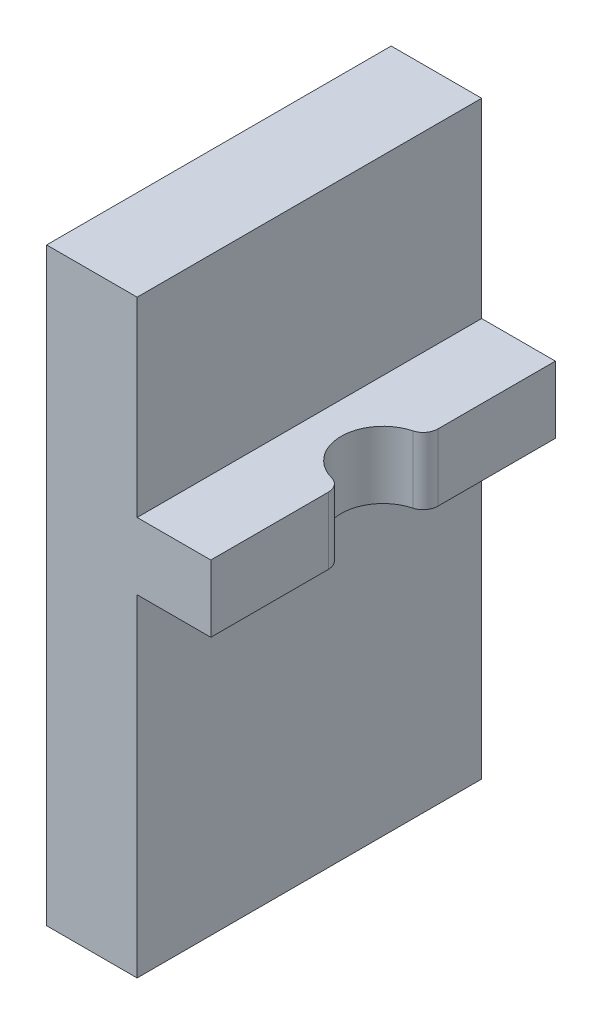
ISO-10303-21;
HEADER;
FILE_DESCRIPTION(('STEP AP214'),'2;1');
FILE_NAME('part.step','',(''),(''),'','','');
FILE_SCHEMA(('AUTOMOTIVE_DESIGN { 1 0 10303 214 1 1 1 1 }'));
ENDSEC;
DATA;
#1=APPLICATION_CONTEXT('core data for automotive mechanical design processes');
#2=APPLICATION_PROTOCOL_DEFINITION('international standard','automotive_design',2000,#1);
#3=PRODUCT_CONTEXT('',#1,'mechanical');
#4=PRODUCT('Part','Part','',(#3));
#5=PRODUCT_RELATED_PRODUCT_CATEGORY('part','',(#4));
#6=PRODUCT_DEFINITION_FORMATION('','',#4);
#7=PRODUCT_DEFINITION_CONTEXT('part definition',#1,'design');
#8=PRODUCT_DEFINITION('design','',#6,#7);
#9=PRODUCT_DEFINITION_SHAPE('','',#8);
#10=(LENGTH_UNIT() NAMED_UNIT(*) SI_UNIT(.MILLI.,.METRE.));
#11=(NAMED_UNIT(*) PLANE_ANGLE_UNIT() SI_UNIT($,.RADIAN.));
#12=(NAMED_UNIT(*) SI_UNIT($,.STERADIAN.) SOLID_ANGLE_UNIT());
#13=UNCERTAINTY_MEASURE_WITH_UNIT(LENGTH_MEASURE(1.E-05),#10,'distance_accuracy_value','');
#14=(GEOMETRIC_REPRESENTATION_CONTEXT(3) GLOBAL_UNCERTAINTY_ASSIGNED_CONTEXT((#13)) GLOBAL_UNIT_ASSIGNED_CONTEXT((#10,
#11,#12)) REPRESENTATION_CONTEXT('',''));
#15=CARTESIAN_POINT('',(0.,0.,0.));
#16=DIRECTION('',(0.,0.,1.));
#17=DIRECTION('',(1.,0.,0.));
#18=AXIS2_PLACEMENT_3D('',#15,#16,#17);
#19=CARTESIAN_POINT('',(-12.6648576385219,0.,0.));
#20=DIRECTION('',(1.,0.,0.));
#21=DIRECTION('',(0.,0.,-1.));
#22=AXIS2_PLACEMENT_3D('',#19,#20,#21);
#23=PLANE('',#22);
#24=DIRECTION('',(0.,0.,1.));
#25=VECTOR('',#24,1.);
#26=CARTESIAN_POINT('',(-12.6648576385219,54.1141840421285,27.1506107128126));
#27=LINE('',#26,#25);
#28=CARTESIAN_POINT('',(-12.6648576385219,54.1141840421285,-19.5956581666387));
#29=VERTEX_POINT('',#28);
#30=CARTESIAN_POINT('',(-12.6648576385219,54.1141840421285,-3.66328566896939));
#31=VERTEX_POINT('',#30);
#32=EDGE_CURVE('E266',#29,#31,#27,.T.);
#33=ORIENTED_EDGE('',*,*,#32,.T.);
#34=DIRECTION('',(0.,-1.,0.));
#35=VECTOR('',#34,1.);
#36=CARTESIAN_POINT('',(-12.6648576385219,45.0345450890142,-3.66328566896939));
#37=LINE('',#36,#35);
#38=CARTESIAN_POINT('',(-12.6648576385219,45.0345450890142,-3.66328566896939));
#39=VERTEX_POINT('',#38);
#40=EDGE_CURVE('E11',#31,#39,#37,.T.);
#41=ORIENTED_EDGE('',*,*,#40,.T.);
#42=DIRECTION('',(0.,0.,-1.));
#43=VECTOR('',#42,1.);
#44=CARTESIAN_POINT('',(-12.6648576385219,45.0345450890142,27.1506107128126));
#45=LINE('',#44,#43);
#46=CARTESIAN_POINT('',(-12.6648576385219,45.0345450890142,-19.5956581666387));
#47=VERTEX_POINT('',#46);
#48=EDGE_CURVE('E140',#39,#47,#45,.T.);
#49=ORIENTED_EDGE('',*,*,#48,.T.);
#50=DIRECTION('',(0.,1.,0.));
#51=VECTOR('',#50,1.);
#52=CARTESIAN_POINT('',(-12.6648576385219,54.1141840421285,-19.5956581666387));
#53=LINE('',#52,#51);
#54=EDGE_CURVE('E139',#47,#29,#53,.T.);
#55=ORIENTED_EDGE('',*,*,#54,.T.);
#56=EDGE_LOOP('',(#33,#41,#49,#55));
#57=FACE_BOUND('',#56,.T.);
#58=ADVANCED_FACE('F39',(#57),#23,.T.);
#59=CARTESIAN_POINT('',(-22.6648576385219,80.,-19.5956581666387));
#60=DIRECTION('',(-1.,0.,0.));
#61=DIRECTION('',(0.,0.,1.));
#62=AXIS2_PLACEMENT_3D('',#59,#60,#61);
#63=PLANE('',#62);
#64=DIRECTION('',(0.,0.,1.));
#65=VECTOR('',#64,1.);
#66=CARTESIAN_POINT('',(-22.6648576385219,54.1141840421285,27.1506107128126));
#67=LINE('',#66,#65);
#68=CARTESIAN_POINT('',(-22.6648576385219,54.1141840421285,-19.5956581666387));
#69=VERTEX_POINT('',#68);
#70=CARTESIAN_POINT('',(-22.6648576385219,54.1141840421285,27.1506107128126));
#71=VERTEX_POINT('',#70);
#72=EDGE_CURVE('E151',#69,#71,#67,.T.);
#73=ORIENTED_EDGE('',*,*,#72,.F.);
#74=DIRECTION('',(0.,-1.,0.));
#75=VECTOR('',#74,1.);
#76=CARTESIAN_POINT('',(-22.6648576385219,80.,-19.5956581666387));
#77=LINE('',#76,#75);
#78=CARTESIAN_POINT('',(-22.6648576385219,80.,-19.5956581666387));
#79=VERTEX_POINT('',#78);
#80=EDGE_CURVE('E198',#79,#69,#77,.T.);
#81=ORIENTED_EDGE('',*,*,#80,.F.);
#82=DIRECTION('',(0.,0.,-1.));
#83=VECTOR('',#82,1.);
#84=CARTESIAN_POINT('',(-22.6648576385219,80.,-19.5956581666387));
#85=LINE('',#84,#83);
#86=CARTESIAN_POINT('',(-22.6648576385219,80.,27.1506107128126));
#87=VERTEX_POINT('',#86);
#88=EDGE_CURVE('E179',#87,#79,#85,.T.);
#89=ORIENTED_EDGE('',*,*,#88,.F.);
#90=DIRECTION('',(0.,-1.,0.));
#91=VECTOR('',#90,1.);
#92=CARTESIAN_POINT('',(-22.6648576385219,80.,27.1506107128126));
#93=LINE('',#92,#91);
#94=EDGE_CURVE('E202',#87,#71,#93,.T.);
#95=ORIENTED_EDGE('',*,*,#94,.T.);
#96=EDGE_LOOP('',(#73,#81,#89,#95));
#97=FACE_BOUND('',#96,.T.);
#98=ADVANCED_FACE('F253',(#97),#63,.F.);
#99=DIRECTION('',(0.,0.,-1.));
#100=VECTOR('',#99,1.);
#101=CARTESIAN_POINT('',(-22.6648576385219,45.0345450890142,27.1506107128126));
#102=LINE('',#101,#100);
#103=CARTESIAN_POINT('',(-22.6648576385219,45.0345450890142,27.1506107128126));
#104=VERTEX_POINT('',#103);
#105=CARTESIAN_POINT('',(-22.6648576385219,45.0345450890142,-19.5956581666387));
#106=VERTEX_POINT('',#105);
#107=EDGE_CURVE('E257',#104,#106,#102,.T.);
#108=ORIENTED_EDGE('',*,*,#107,.F.);
#109=CARTESIAN_POINT('',(-22.6648576385219,0.,27.1506107128126));
#110=VERTEX_POINT('',#109);
#111=EDGE_CURVE('E156',#104,#110,#93,.T.);
#112=ORIENTED_EDGE('',*,*,#111,.T.);
#113=DIRECTION('',(0.,0.,-1.));
#114=VECTOR('',#113,1.);
#115=CARTESIAN_POINT('',(-22.6648576385219,0.,-19.5956581666387));
#116=LINE('',#115,#114);
#117=CARTESIAN_POINT('',(-22.6648576385219,0.,-19.5956581666387));
#118=VERTEX_POINT('',#117);
#119=EDGE_CURVE('E188',#110,#118,#116,.T.);
#120=ORIENTED_EDGE('',*,*,#119,.T.);
#121=EDGE_CURVE('E197',#106,#118,#77,.T.);
#122=ORIENTED_EDGE('',*,*,#121,.F.);
#123=EDGE_LOOP('',(#108,#112,#120,#122));
#124=FACE_BOUND('',#123,.T.);
#125=ADVANCED_FACE('F236',(#124),#63,.F.);
#126=CARTESIAN_POINT('',(-34.9416555260545,80.,-19.5956581666387));
#127=DIRECTION('',(1.,0.,0.));
#128=DIRECTION('',(0.,0.,-1.));
#129=AXIS2_PLACEMENT_3D('',#126,#127,#128);
#130=PLANE('',#129);
#131=DIRECTION('',(0.,0.,1.));
#132=VECTOR('',#131,1.);
#133=CARTESIAN_POINT('',(-34.9416555260545,0.,-19.5956581666387));
#134=LINE('',#133,#132);
#135=CARTESIAN_POINT('',(-34.9416555260545,0.,-19.5956581666387));
#136=VERTEX_POINT('',#135);
#137=CARTESIAN_POINT('',(-34.9416555260545,0.,27.1506107128126));
#138=VERTEX_POINT('',#137);
#139=EDGE_CURVE('E158',#136,#138,#134,.T.);
#140=ORIENTED_EDGE('',*,*,#139,.T.);
#141=DIRECTION('',(0.,-1.,0.));
#142=VECTOR('',#141,1.);
#143=CARTESIAN_POINT('',(-34.9416555260545,80.,27.1506107128126));
#144=LINE('',#143,#142);
#145=CARTESIAN_POINT('',(-34.9416555260545,80.,27.1506107128126));
#146=VERTEX_POINT('',#145);
#147=EDGE_CURVE('E205',#146,#138,#144,.T.);
#148=ORIENTED_EDGE('',*,*,#147,.F.);
#149=DIRECTION('',(0.,0.,1.));
#150=VECTOR('',#149,1.);
#151=CARTESIAN_POINT('',(-34.9416555260545,80.,-19.5956581666387));
#152=LINE('',#151,#150);
#153=CARTESIAN_POINT('',(-34.9416555260545,80.,-19.5956581666387));
#154=VERTEX_POINT('',#153);
#155=EDGE_CURVE('E171',#154,#146,#152,.T.);
#156=ORIENTED_EDGE('',*,*,#155,.F.);
#157=DIRECTION('',(0.,-1.,0.));
#158=VECTOR('',#157,1.);
#159=CARTESIAN_POINT('',(-34.9416555260545,80.,-19.5956581666387));
#160=LINE('',#159,#158);
#161=EDGE_CURVE('E184',#154,#136,#160,.T.);
#162=ORIENTED_EDGE('',*,*,#161,.T.);
#163=EDGE_LOOP('',(#140,#148,#156,#162));
#164=FACE_BOUND('',#163,.T.);
#165=ADVANCED_FACE('F242',(#164),#130,.F.);
#166=CARTESIAN_POINT('',(-34.9416555260545,80.,27.1506107128126));
#167=DIRECTION('',(0.,0.,-1.));
#168=DIRECTION('',(-1.,0.,0.));
#169=AXIS2_PLACEMENT_3D('',#166,#167,#168);
#170=PLANE('',#169);
#171=DIRECTION('',(1.,0.,0.));
#172=VECTOR('',#171,1.);
#173=CARTESIAN_POINT('',(-34.9416555260545,0.,27.1506107128126));
#174=LINE('',#173,#172);
#175=EDGE_CURVE('E164',#138,#110,#174,.T.);
#176=ORIENTED_EDGE('',*,*,#175,.T.);
#177=ORIENTED_EDGE('',*,*,#111,.F.);
#178=DIRECTION('',(-1.,0.,0.));
#179=VECTOR('',#178,1.);
#180=CARTESIAN_POINT('',(-12.6648576385219,45.0345450890142,27.1506107128126));
#181=LINE('',#180,#179);
#182=CARTESIAN_POINT('',(-12.6648576385219,45.0345450890142,27.1506107128126));
#183=VERTEX_POINT('',#182);
#184=EDGE_CURVE('E133',#183,#104,#181,.T.);
#185=ORIENTED_EDGE('',*,*,#184,.F.);
#186=DIRECTION('',(0.,-1.,0.));
#187=VECTOR('',#186,1.);
#188=CARTESIAN_POINT('',(-12.6648576385219,54.1141840421285,27.1506107128126));
#189=LINE('',#188,#187);
#190=CARTESIAN_POINT('',(-12.6648576385219,54.1141840421285,27.1506107128126));
#191=VERTEX_POINT('',#190);
#192=EDGE_CURVE('E143',#191,#183,#189,.T.);
#193=ORIENTED_EDGE('',*,*,#192,.F.);
#194=DIRECTION('',(-1.,0.,0.));
#195=VECTOR('',#194,1.);
#196=CARTESIAN_POINT('',(-12.6648576385219,54.1141840421285,27.1506107128126));
#197=LINE('',#196,#195);
#198=EDGE_CURVE('E264',#191,#71,#197,.T.);
#199=ORIENTED_EDGE('',*,*,#198,.T.);
#200=ORIENTED_EDGE('',*,*,#94,.F.);
#201=DIRECTION('',(1.,0.,0.));
#202=VECTOR('',#201,1.);
#203=CARTESIAN_POINT('',(-34.9416555260545,80.,27.1506107128126));
#204=LINE('',#203,#202);
#205=EDGE_CURVE('E175',#146,#87,#204,.T.);
#206=ORIENTED_EDGE('',*,*,#205,.F.);
#207=ORIENTED_EDGE('',*,*,#147,.T.);
#208=EDGE_LOOP('',(#176,#177,#185,#193,#199,#200,#206,#207));
#209=FACE_BOUND('',#208,.T.);
#210=ADVANCED_FACE('F155',(#209),#170,.F.);
#211=CARTESIAN_POINT('',(-34.9416555260545,80.,-19.5956581666387));
#212=DIRECTION('',(0.,0.,1.));
#213=DIRECTION('',(1.,0.,0.));
#214=AXIS2_PLACEMENT_3D('',#211,#212,#213);
#215=PLANE('',#214);
#216=DIRECTION('',(-1.,0.,0.));
#217=VECTOR('',#216,1.);
#218=CARTESIAN_POINT('',(-34.9416555260545,0.,-19.5956581666387));
#219=LINE('',#218,#217);
#220=EDGE_CURVE('E176',#118,#136,#219,.T.);
#221=ORIENTED_EDGE('',*,*,#220,.T.);
#222=ORIENTED_EDGE('',*,*,#161,.F.);
#223=DIRECTION('',(-1.,0.,0.));
#224=VECTOR('',#223,1.);
#225=CARTESIAN_POINT('',(-34.9416555260545,80.,-19.5956581666387));
#226=LINE('',#225,#224);
#227=EDGE_CURVE('E182',#79,#154,#226,.T.);
#228=ORIENTED_EDGE('',*,*,#227,.F.);
#229=ORIENTED_EDGE('',*,*,#80,.T.);
#230=DIRECTION('',(-1.,0.,0.));
#231=VECTOR('',#230,1.);
#232=CARTESIAN_POINT('',(-12.6648576385219,54.1141840421285,-19.5956581666387));
#233=LINE('',#232,#231);
#234=EDGE_CURVE('E167',#29,#69,#233,.T.);
#235=ORIENTED_EDGE('',*,*,#234,.F.);
#236=ORIENTED_EDGE('',*,*,#54,.F.);
#237=DIRECTION('',(-1.,0.,0.));
#238=VECTOR('',#237,1.);
#239=CARTESIAN_POINT('',(-12.6648576385219,45.0345450890142,-19.5956581666387));
#240=LINE('',#239,#238);
#241=EDGE_CURVE('E159',#47,#106,#240,.T.);
#242=ORIENTED_EDGE('',*,*,#241,.T.);
#243=ORIENTED_EDGE('',*,*,#121,.T.);
#244=EDGE_LOOP('',(#221,#222,#228,#229,#235,#236,#242,#243));
#245=FACE_BOUND('',#244,.T.);
#246=ADVANCED_FACE('F229',(#245),#215,.F.);
#247=CARTESIAN_POINT('',(0.,80.,0.));
#248=DIRECTION('',(0.,1.,0.));
#249=DIRECTION('',(0.,0.,1.));
#250=AXIS2_PLACEMENT_3D('',#247,#248,#249);
#251=PLANE('',#250);
#252=ORIENTED_EDGE('',*,*,#155,.T.);
#253=ORIENTED_EDGE('',*,*,#205,.T.);
#254=ORIENTED_EDGE('',*,*,#88,.T.);
#255=ORIENTED_EDGE('',*,*,#227,.T.);
#256=EDGE_LOOP('',(#252,#253,#254,#255));
#257=FACE_BOUND('',#256,.T.);
#258=ADVANCED_FACE('F249',(#257),#251,.T.);
#259=CARTESIAN_POINT('',(0.,0.,0.));
#260=DIRECTION('',(0.,1.,0.));
#261=DIRECTION('',(0.,0.,1.));
#262=AXIS2_PLACEMENT_3D('',#259,#260,#261);
#263=PLANE('',#262);
#264=ORIENTED_EDGE('',*,*,#139,.F.);
#265=ORIENTED_EDGE('',*,*,#220,.F.);
#266=ORIENTED_EDGE('',*,*,#119,.F.);
#267=ORIENTED_EDGE('',*,*,#175,.F.);
#268=EDGE_LOOP('',(#264,#265,#266,#267));
#269=FACE_BOUND('',#268,.T.);
#270=ADVANCED_FACE('F239',(#269),#263,.F.);
#271=CARTESIAN_POINT('',(-12.6648576385219,45.0345450890142,27.1506107128126));
#272=DIRECTION('',(0.,1.,0.));
#273=DIRECTION('',(0.,0.,1.));
#274=AXIS2_PLACEMENT_3D('',#271,#272,#273);
#275=PLANE('',#274);
#276=CARTESIAN_POINT('',(-12.6648576385219,45.0345450890142,3.77747627308696));
#277=DIRECTION('',(0.,1.,0.));
#278=DIRECTION('',(0.,0.,1.));
#279=AXIS2_PLACEMENT_3D('',#276,#277,#278);
#280=CIRCLE('',#279,5.70486458533531);
#281=CARTESIAN_POINT('',(-14.145705101096,45.0345450890142,9.2867929938429));
#282=VERTEX_POINT('',#281);
#283=CARTESIAN_POINT('',(-14.145705101096,45.0345450890142,-1.73184044766897));
#284=VERTEX_POINT('',#283);
#285=EDGE_CURVE('E260',#282,#284,#280,.F.);
#286=ORIENTED_EDGE('',*,*,#285,.F.);
#287=CARTESIAN_POINT('',(-14.6648576385219,45.0345450890142,11.2182382151433));
#288=DIRECTION('',(0.,1.,0.));
#289=DIRECTION('',(0.,0.,1.));
#290=AXIS2_PLACEMENT_3D('',#287,#288,#289);
#291=CIRCLE('',#290,2.);
#292=CARTESIAN_POINT('',(-12.6648576385219,45.0345450890142,11.2182382151433));
#293=VERTEX_POINT('',#292);
#294=EDGE_CURVE('E48',#282,#293,#291,.F.);
#295=ORIENTED_EDGE('',*,*,#294,.T.);
#296=EDGE_CURVE('E128',#183,#293,#45,.T.);
#297=ORIENTED_EDGE('',*,*,#296,.F.);
#298=ORIENTED_EDGE('',*,*,#184,.T.);
#299=ORIENTED_EDGE('',*,*,#107,.T.);
#300=ORIENTED_EDGE('',*,*,#241,.F.);
#301=ORIENTED_EDGE('',*,*,#48,.F.);
#302=CARTESIAN_POINT('',(-14.6648576385219,45.0345450890142,-3.66328566896939));
#303=DIRECTION('',(0.,1.,0.));
#304=DIRECTION('',(0.,0.,1.));
#305=AXIS2_PLACEMENT_3D('',#302,#303,#304);
#306=CIRCLE('',#305,2.);
#307=EDGE_CURVE('E55',#39,#284,#306,.F.);
#308=ORIENTED_EDGE('',*,*,#307,.T.);
#309=EDGE_LOOP('',(#286,#295,#297,#298,#299,#300,#301,#308));
#310=FACE_BOUND('',#309,.T.);
#311=ADVANCED_FACE('F130',(#310),#275,.F.);
#312=CARTESIAN_POINT('',(-12.6648576385219,54.1141840421285,27.1506107128126));
#313=DIRECTION('',(0.,-1.,0.));
#314=DIRECTION('',(0.,0.,-1.));
#315=AXIS2_PLACEMENT_3D('',#312,#313,#314);
#316=PLANE('',#315);
#317=CARTESIAN_POINT('',(-12.6648576385219,54.1141840421285,11.2182382151433));
#318=VERTEX_POINT('',#317);
#319=EDGE_CURVE('E146',#318,#191,#27,.T.);
#320=ORIENTED_EDGE('',*,*,#319,.F.);
#321=CARTESIAN_POINT('',(-14.6648576385219,54.1141840421285,11.2182382151433));
#322=DIRECTION('',(0.,-1.,0.));
#323=DIRECTION('',(0.,0.,-1.));
#324=AXIS2_PLACEMENT_3D('',#321,#322,#323);
#325=CIRCLE('',#324,2.);
#326=CARTESIAN_POINT('',(-14.145705101096,54.1141840421285,9.2867929938429));
#327=VERTEX_POINT('',#326);
#328=EDGE_CURVE('E215',#318,#327,#325,.F.);
#329=ORIENTED_EDGE('',*,*,#328,.T.);
#330=CARTESIAN_POINT('',(-12.6648576385219,54.1141840421285,3.77747627308696));
#331=DIRECTION('',(0.,1.,0.));
#332=DIRECTION('',(0.,0.,1.));
#333=AXIS2_PLACEMENT_3D('',#330,#331,#332);
#334=CIRCLE('',#333,5.70486458533531);
#335=CARTESIAN_POINT('',(-14.145705101096,54.1141840421285,-1.73184044766897));
#336=VERTEX_POINT('',#335);
#337=EDGE_CURVE('E279',#336,#327,#334,.T.);
#338=ORIENTED_EDGE('',*,*,#337,.F.);
#339=CARTESIAN_POINT('',(-14.6648576385219,54.1141840421285,-3.66328566896939));
#340=DIRECTION('',(0.,-1.,0.));
#341=DIRECTION('',(0.,0.,-1.));
#342=AXIS2_PLACEMENT_3D('',#339,#340,#341);
#343=CIRCLE('',#342,2.);
#344=EDGE_CURVE('E212',#336,#31,#343,.F.);
#345=ORIENTED_EDGE('',*,*,#344,.T.);
#346=ORIENTED_EDGE('',*,*,#32,.F.);
#347=ORIENTED_EDGE('',*,*,#234,.T.);
#348=ORIENTED_EDGE('',*,*,#72,.T.);
#349=ORIENTED_EDGE('',*,*,#198,.F.);
#350=EDGE_LOOP('',(#320,#329,#338,#345,#346,#347,#348,#349));
#351=FACE_BOUND('',#350,.T.);
#352=ADVANCED_FACE('F269',(#351),#316,.F.);
#353=ORIENTED_EDGE('',*,*,#296,.T.);
#354=DIRECTION('',(0.,-1.,0.));
#355=VECTOR('',#354,1.);
#356=CARTESIAN_POINT('',(-12.6648576385219,54.1141840421285,11.2182382151433));
#357=LINE('',#356,#355);
#358=EDGE_CURVE('E209',#293,#318,#357,.F.);
#359=ORIENTED_EDGE('',*,*,#358,.T.);
#360=ORIENTED_EDGE('',*,*,#319,.T.);
#361=ORIENTED_EDGE('',*,*,#192,.T.);
#362=EDGE_LOOP('',(#353,#359,#360,#361));
#363=FACE_BOUND('',#362,.T.);
#364=ADVANCED_FACE('F144',(#363),#23,.T.);
#365=CARTESIAN_POINT('',(-12.6648576385219,-0.001000000000001,3.77747627308696));
#366=DIRECTION('',(0.,1.,0.));
#367=DIRECTION('',(0.,0.,1.));
#368=AXIS2_PLACEMENT_3D('',#365,#366,#367);
#369=CYLINDRICAL_SURFACE('',#368,5.70486458533531);
#370=ORIENTED_EDGE('',*,*,#337,.T.);
#371=DIRECTION('',(0.,1.,0.));
#372=VECTOR('',#371,1.);
#373=CARTESIAN_POINT('',(-14.145705101096,-0.001000000000001,9.2867929938429));
#374=LINE('',#373,#372);
#375=EDGE_CURVE('E221',#327,#282,#374,.F.);
#376=ORIENTED_EDGE('',*,*,#375,.T.);
#377=ORIENTED_EDGE('',*,*,#285,.T.);
#378=DIRECTION('',(0.,1.,0.));
#379=VECTOR('',#378,1.);
#380=CARTESIAN_POINT('',(-14.145705101096,-0.001000000000001,-1.73184044766897));
#381=LINE('',#380,#379);
#382=EDGE_CURVE('E218',#284,#336,#381,.T.);
#383=ORIENTED_EDGE('',*,*,#382,.T.);
#384=EDGE_LOOP('',(#370,#376,#377,#383));
#385=FACE_BOUND('',#384,.T.);
#386=ADVANCED_FACE('F286',(#385),#369,.F.);
#387=CARTESIAN_POINT('',(-14.6648576385219,-0.001000000000001,11.2182382151433));
#388=DIRECTION('',(0.,1.,0.));
#389=DIRECTION('',(0.,0.,1.));
#390=AXIS2_PLACEMENT_3D('',#387,#388,#389);
#391=CYLINDRICAL_SURFACE('',#390,2.);
#392=ORIENTED_EDGE('',*,*,#294,.F.);
#393=ORIENTED_EDGE('',*,*,#375,.F.);
#394=ORIENTED_EDGE('',*,*,#328,.F.);
#395=ORIENTED_EDGE('',*,*,#358,.F.);
#396=EDGE_LOOP('',(#392,#393,#394,#395));
#397=FACE_BOUND('',#396,.T.);
#398=ADVANCED_FACE('F288',(#397),#391,.T.);
#399=CARTESIAN_POINT('',(-14.6648576385219,-0.001000000000001,-3.66328566896939));
#400=DIRECTION('',(0.,1.,0.));
#401=DIRECTION('',(0.,0.,1.));
#402=AXIS2_PLACEMENT_3D('',#399,#400,#401);
#403=CYLINDRICAL_SURFACE('',#402,2.);
#404=ORIENTED_EDGE('',*,*,#344,.F.);
#405=ORIENTED_EDGE('',*,*,#382,.F.);
#406=ORIENTED_EDGE('',*,*,#307,.F.);
#407=ORIENTED_EDGE('',*,*,#40,.F.);
#408=EDGE_LOOP('',(#404,#405,#406,#407));
#409=FACE_BOUND('',#408,.T.);
#410=ADVANCED_FACE('F41',(#409),#403,.T.);
#411=CLOSED_SHELL('',(#58,#98,#125,#165,#210,#246,#258,#270,#311,#352,#364,#386,#398,#410));
#412=MANIFOLD_SOLID_BREP('B2',#411);
#413=ADVANCED_BREP_SHAPE_REPRESENTATION('',(#18,#412),#14);
#414=SHAPE_DEFINITION_REPRESENTATION(#9,#413);
ENDSEC;
END-ISO-10303-21;
